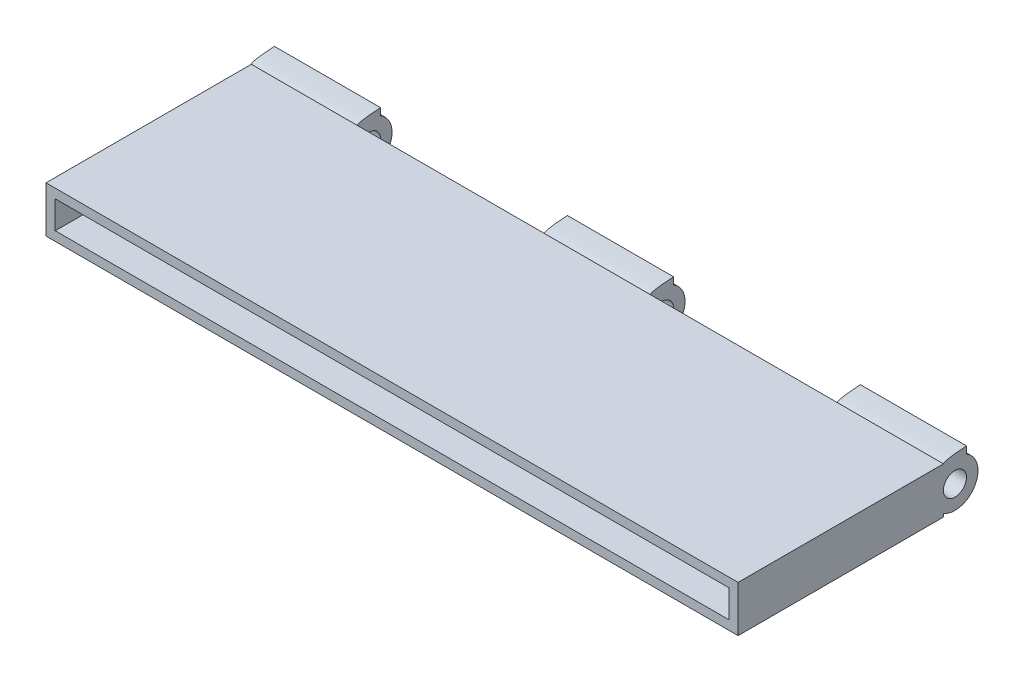
ISO-10303-21;
HEADER;
FILE_DESCRIPTION(('STEP AP214'),'2;1');
FILE_NAME('part.step','',(''),(''),'','','');
FILE_SCHEMA(('AUTOMOTIVE_DESIGN { 1 0 10303 214 1 1 1 1 }'));
ENDSEC;
DATA;
#1=APPLICATION_CONTEXT('core data for automotive mechanical design processes');
#2=APPLICATION_PROTOCOL_DEFINITION('international standard','automotive_design',2000,#1);
#3=PRODUCT_CONTEXT('',#1,'mechanical');
#4=PRODUCT('Part','Part','',(#3));
#5=PRODUCT_RELATED_PRODUCT_CATEGORY('part','',(#4));
#6=PRODUCT_DEFINITION_FORMATION('','',#4);
#7=PRODUCT_DEFINITION_CONTEXT('part definition',#1,'design');
#8=PRODUCT_DEFINITION('design','',#6,#7);
#9=PRODUCT_DEFINITION_SHAPE('','',#8);
#10=(LENGTH_UNIT() NAMED_UNIT(*) SI_UNIT(.MILLI.,.METRE.));
#11=(NAMED_UNIT(*) PLANE_ANGLE_UNIT() SI_UNIT($,.RADIAN.));
#12=(NAMED_UNIT(*) SI_UNIT($,.STERADIAN.) SOLID_ANGLE_UNIT());
#13=UNCERTAINTY_MEASURE_WITH_UNIT(LENGTH_MEASURE(1.E-05),#10,'distance_accuracy_value','');
#14=(GEOMETRIC_REPRESENTATION_CONTEXT(3) GLOBAL_UNCERTAINTY_ASSIGNED_CONTEXT((#13)) GLOBAL_UNIT_ASSIGNED_CONTEXT((#10,
#11,#12)) REPRESENTATION_CONTEXT('',''));
#15=CARTESIAN_POINT('',(0.,0.,0.));
#16=DIRECTION('',(0.,0.,1.));
#17=DIRECTION('',(1.,0.,0.));
#18=AXIS2_PLACEMENT_3D('',#15,#16,#17);
#19=CARTESIAN_POINT('',(154.,6.98677371199543,14.5));
#20=DIRECTION('',(0.,0.,1.));
#21=DIRECTION('',(0.,-1.,0.));
#22=AXIS2_PLACEMENT_3D('',#19,#20,#21);
#23=PLANE('',#22);
#24=DIRECTION('',(-1.,0.,0.));
#25=VECTOR('',#24,1.);
#26=CARTESIAN_POINT('',(154.,4.33012701892219,14.5));
#27=LINE('',#26,#25);
#28=CARTESIAN_POINT('',(52.,4.33012701892219,14.5));
#29=VERTEX_POINT('',#28);
#30=CARTESIAN_POINT('',(11.5,4.33012701892219,14.5));
#31=VERTEX_POINT('',#30);
#32=EDGE_CURVE('E686',#29,#31,#27,.T.);
#33=ORIENTED_EDGE('',*,*,#32,.T.);
#34=DIRECTION('',(0.,-1.,0.));
#35=VECTOR('',#34,1.);
#36=CARTESIAN_POINT('',(11.5,6.,14.5));
#37=LINE('',#36,#35);
#38=CARTESIAN_POINT('',(11.5,5.,14.5));
#39=VERTEX_POINT('',#38);
#40=EDGE_CURVE('E347',#39,#31,#37,.T.);
#41=ORIENTED_EDGE('',*,*,#40,.F.);
#42=DIRECTION('',(1.,0.,0.));
#43=VECTOR('',#42,1.);
#44=CARTESIAN_POINT('',(154.,5.,14.5));
#45=LINE('',#44,#43);
#46=CARTESIAN_POINT('',(52.,5.,14.5));
#47=VERTEX_POINT('',#46);
#48=EDGE_CURVE('E330',#39,#47,#45,.T.);
#49=ORIENTED_EDGE('',*,*,#48,.T.);
#50=DIRECTION('',(0.,-1.,0.));
#51=VECTOR('',#50,1.);
#52=CARTESIAN_POINT('',(52.,6.,14.5));
#53=LINE('',#52,#51);
#54=EDGE_CURVE('E354',#47,#29,#53,.T.);
#55=ORIENTED_EDGE('',*,*,#54,.T.);
#56=EDGE_LOOP('',(#33,#41,#49,#55));
#57=FACE_BOUND('',#56,.T.);
#58=ADVANCED_FACE('F125',(#57),#23,.F.);
#59=CARTESIAN_POINT('',(-75.,-5.,0.));
#60=DIRECTION('',(0.,-1.,0.));
#61=DIRECTION('',(0.,0.,-1.));
#62=AXIS2_PLACEMENT_3D('',#59,#60,#61);
#63=PLANE('',#62);
#64=DIRECTION('',(1.,0.,0.));
#65=VECTOR('',#64,1.);
#66=CARTESIAN_POINT('',(-75.,-5.,59.));
#67=LINE('',#66,#65);
#68=CARTESIAN_POINT('',(-75.,-5.,59.));
#69=VERTEX_POINT('',#68);
#70=CARTESIAN_POINT('',(75.,-5.,59.));
#71=VERTEX_POINT('',#70);
#72=EDGE_CURVE('E363',#69,#71,#67,.T.);
#73=ORIENTED_EDGE('',*,*,#72,.F.);
#74=DIRECTION('',(0.,0.,1.));
#75=VECTOR('',#74,1.);
#76=CARTESIAN_POINT('',(-75.,-5.,0.));
#77=LINE('',#76,#75);
#78=CARTESIAN_POINT('',(-75.,-5.,14.5));
#79=VERTEX_POINT('',#78);
#80=EDGE_CURVE('E795',#79,#69,#77,.T.);
#81=ORIENTED_EDGE('',*,*,#80,.F.);
#82=DIRECTION('',(-1.,0.,0.));
#83=VECTOR('',#82,1.);
#84=CARTESIAN_POINT('',(154.,-5.,14.5));
#85=LINE('',#84,#83);
#86=CARTESIAN_POINT('',(75.,-5.,14.5));
#87=VERTEX_POINT('',#86);
#88=EDGE_CURVE('E337',#87,#79,#85,.T.);
#89=ORIENTED_EDGE('',*,*,#88,.F.);
#90=DIRECTION('',(0.,0.,1.));
#91=VECTOR('',#90,1.);
#92=CARTESIAN_POINT('',(75.,-5.,0.));
#93=LINE('',#92,#91);
#94=EDGE_CURVE('E717',#87,#71,#93,.T.);
#95=ORIENTED_EDGE('',*,*,#94,.T.);
#96=EDGE_LOOP('',(#73,#81,#89,#95));
#97=FACE_BOUND('',#96,.T.);
#98=ADVANCED_FACE('F565',(#97),#63,.T.);
#99=CARTESIAN_POINT('',(-75.,5.,0.));
#100=DIRECTION('',(0.,1.,0.));
#101=DIRECTION('',(-1.,0.,0.));
#102=AXIS2_PLACEMENT_3D('',#99,#100,#101);
#103=PLANE('',#102);
#104=DIRECTION('',(-1.,0.,0.));
#105=VECTOR('',#104,1.);
#106=CARTESIAN_POINT('',(-75.,5.,59.));
#107=LINE('',#106,#105);
#108=CARTESIAN_POINT('',(75.,5.,59.));
#109=VERTEX_POINT('',#108);
#110=CARTESIAN_POINT('',(-75.,5.,59.));
#111=VERTEX_POINT('',#110);
#112=EDGE_CURVE('E842',#109,#111,#107,.T.);
#113=ORIENTED_EDGE('',*,*,#112,.F.);
#114=DIRECTION('',(0.,0.,-1.));
#115=VECTOR('',#114,1.);
#116=CARTESIAN_POINT('',(75.,5.,0.));
#117=LINE('',#116,#115);
#118=CARTESIAN_POINT('',(75.,5.,14.5));
#119=VERTEX_POINT('',#118);
#120=EDGE_CURVE('E713',#109,#119,#117,.T.);
#121=ORIENTED_EDGE('',*,*,#120,.T.);
#122=CARTESIAN_POINT('',(50.85,5.,14.5));
#123=CARTESIAN_POINT('',(59.2833333333334,5.,14.5));
#124=CARTESIAN_POINT('',(67.7166666666666,5.,14.5));
#125=CARTESIAN_POINT('',(76.15,5.,14.5));
#126=(BOUNDED_CURVE() B_SPLINE_CURVE(3,(#122,#123,#124,#125),.UNSPECIFIED.,.F.,
.F.) B_SPLINE_CURVE_WITH_KNOTS((4,4),(-0.02415,0.00115),
.UNSPECIFIED.) CURVE() GEOMETRIC_REPRESENTATION_ITEM() RATIONAL_B_SPLINE_CURVE((1.,1.,1.,1.)) REPRESENTATION_ITEM(''));
#127=EDGE_CURVE('E373',#47,#119,#126,.T.);
#128=ORIENTED_EDGE('',*,*,#127,.F.);
#129=ORIENTED_EDGE('',*,*,#48,.F.);
#130=CARTESIAN_POINT('',(-12.65,5.,14.5));
#131=CARTESIAN_POINT('',(-4.21666666666668,5.,14.5));
#132=CARTESIAN_POINT('',(4.21666666666665,5.,14.5));
#133=CARTESIAN_POINT('',(12.65,5.,14.5));
#134=(BOUNDED_CURVE() B_SPLINE_CURVE(3,(#130,#131,#132,#133),.UNSPECIFIED.,.F.,
.F.) B_SPLINE_CURVE_WITH_KNOTS((4,4),(-0.02415,0.00115),
.UNSPECIFIED.) CURVE() GEOMETRIC_REPRESENTATION_ITEM() RATIONAL_B_SPLINE_CURVE((1.,1.,1.,1.)) REPRESENTATION_ITEM(''));
#135=CARTESIAN_POINT('',(-11.5,5.,14.5));
#136=VERTEX_POINT('',#135);
#137=EDGE_CURVE('E473',#136,#39,#134,.T.);
#138=ORIENTED_EDGE('',*,*,#137,.F.);
#139=CARTESIAN_POINT('',(-52.,5.,14.5));
#140=VERTEX_POINT('',#139);
#141=EDGE_CURVE('E324',#140,#136,#45,.T.);
#142=ORIENTED_EDGE('',*,*,#141,.F.);
#143=CARTESIAN_POINT('',(-76.15,5.,14.5));
#144=CARTESIAN_POINT('',(-67.7166666666666,5.,14.5));
#145=CARTESIAN_POINT('',(-59.2833333333334,5.,14.5));
#146=CARTESIAN_POINT('',(-50.85,5.,14.5));
#147=(BOUNDED_CURVE() B_SPLINE_CURVE(3,(#143,#144,#145,#146),.UNSPECIFIED.,.F.,
.F.) B_SPLINE_CURVE_WITH_KNOTS((4,4),(-0.02415,0.00115),
.UNSPECIFIED.) CURVE() GEOMETRIC_REPRESENTATION_ITEM() RATIONAL_B_SPLINE_CURVE((1.,1.,1.,1.)) REPRESENTATION_ITEM(''));
#148=CARTESIAN_POINT('',(-75.,5.,14.5));
#149=VERTEX_POINT('',#148);
#150=EDGE_CURVE('E329',#149,#140,#147,.T.);
#151=ORIENTED_EDGE('',*,*,#150,.F.);
#152=DIRECTION('',(0.,0.,1.));
#153=VECTOR('',#152,1.);
#154=CARTESIAN_POINT('',(-75.,5.,0.));
#155=LINE('',#154,#153);
#156=EDGE_CURVE('E706',#149,#111,#155,.T.);
#157=ORIENTED_EDGE('',*,*,#156,.T.);
#158=EDGE_LOOP('',(#113,#121,#128,#129,#138,#142,#151,#157));
#159=FACE_BOUND('',#158,.T.);
#160=ADVANCED_FACE('F554',(#159),#103,.T.);
#161=CARTESIAN_POINT('',(-11.5,4.33012701892219,14.5));
#162=VERTEX_POINT('',#161);
#163=CARTESIAN_POINT('',(-52.,4.33012701892219,14.5));
#164=VERTEX_POINT('',#163);
#165=EDGE_CURVE('E680',#162,#164,#27,.T.);
#166=ORIENTED_EDGE('',*,*,#165,.T.);
#167=DIRECTION('',(0.,-1.,0.));
#168=VECTOR('',#167,1.);
#169=CARTESIAN_POINT('',(-52.,6.,14.5));
#170=LINE('',#169,#168);
#171=EDGE_CURVE('E288',#140,#164,#170,.T.);
#172=ORIENTED_EDGE('',*,*,#171,.F.);
#173=ORIENTED_EDGE('',*,*,#141,.T.);
#174=DIRECTION('',(0.,-1.,0.));
#175=VECTOR('',#174,1.);
#176=CARTESIAN_POINT('',(-11.5,6.,14.5));
#177=LINE('',#176,#175);
#178=EDGE_CURVE('E474',#136,#162,#177,.T.);
#179=ORIENTED_EDGE('',*,*,#178,.T.);
#180=EDGE_LOOP('',(#166,#172,#173,#179));
#181=FACE_BOUND('',#180,.T.);
#182=ADVANCED_FACE('F564',(#181),#23,.F.);
#183=CARTESIAN_POINT('',(154.,-4.33012701892219,14.5));
#184=DIRECTION('',(0.,0.,1.));
#185=DIRECTION('',(1.,0.,0.));
#186=AXIS2_PLACEMENT_3D('',#183,#184,#185);
#187=PLANE('',#186);
#188=DIRECTION('',(0.,1.,0.));
#189=VECTOR('',#188,1.);
#190=CARTESIAN_POINT('',(75.,50.,14.5));
#191=LINE('',#190,#189);
#192=CARTESIAN_POINT('',(75.,-4.33012701892219,14.5));
#193=VERTEX_POINT('',#192);
#194=EDGE_CURVE('E710',#87,#193,#191,.T.);
#195=ORIENTED_EDGE('',*,*,#194,.F.);
#196=ORIENTED_EDGE('',*,*,#88,.T.);
#197=DIRECTION('',(0.,1.,0.));
#198=VECTOR('',#197,1.);
#199=CARTESIAN_POINT('',(-75.,-4.33012701892219,14.5));
#200=LINE('',#199,#198);
#201=CARTESIAN_POINT('',(-75.,-4.33012701892219,14.5));
#202=VERTEX_POINT('',#201);
#203=EDGE_CURVE('E301',#79,#202,#200,.T.);
#204=ORIENTED_EDGE('',*,*,#203,.T.);
#205=DIRECTION('',(-1.,0.,0.));
#206=VECTOR('',#205,1.);
#207=CARTESIAN_POINT('',(154.,-4.33012701892219,14.5));
#208=LINE('',#207,#206);
#209=CARTESIAN_POINT('',(-52.,-4.33012701892219,14.5));
#210=VERTEX_POINT('',#209);
#211=EDGE_CURVE('E790',#210,#202,#208,.T.);
#212=ORIENTED_EDGE('',*,*,#211,.F.);
#213=CARTESIAN_POINT('',(-11.5,-4.33012701892219,14.5));
#214=VERTEX_POINT('',#213);
#215=EDGE_CURVE('E690',#214,#210,#208,.T.);
#216=ORIENTED_EDGE('',*,*,#215,.F.);
#217=CARTESIAN_POINT('',(11.5,-4.33012701892219,14.5));
#218=VERTEX_POINT('',#217);
#219=EDGE_CURVE('E803',#218,#214,#208,.T.);
#220=ORIENTED_EDGE('',*,*,#219,.F.);
#221=CARTESIAN_POINT('',(52.,-4.33012701892219,14.5));
#222=VERTEX_POINT('',#221);
#223=EDGE_CURVE('E800',#222,#218,#208,.T.);
#224=ORIENTED_EDGE('',*,*,#223,.F.);
#225=EDGE_CURVE('E687',#193,#222,#208,.T.);
#226=ORIENTED_EDGE('',*,*,#225,.F.);
#227=EDGE_LOOP('',(#195,#196,#204,#212,#216,#220,#224,#226));
#228=FACE_BOUND('',#227,.T.);
#229=ADVANCED_FACE('F566',(#228),#187,.F.);
#230=CARTESIAN_POINT('',(154.,0.,12.));
#231=DIRECTION('',(-1.,0.,0.));
#232=DIRECTION('',(0.,0.,1.));
#233=AXIS2_PLACEMENT_3D('',#230,#231,#232);
#234=CYLINDRICAL_SURFACE('',#233,5.);
#235=ORIENTED_EDGE('',*,*,#32,.F.);
#236=CARTESIAN_POINT('',(52.,0.,12.));
#237=DIRECTION('',(-1.,0.,0.));
#238=DIRECTION('',(0.,0.,1.));
#239=AXIS2_PLACEMENT_3D('',#236,#237,#238);
#240=CIRCLE('',#239,5.);
#241=EDGE_CURVE('E750',#222,#29,#240,.T.);
#242=ORIENTED_EDGE('',*,*,#241,.F.);
#243=ORIENTED_EDGE('',*,*,#223,.T.);
#244=CARTESIAN_POINT('',(11.5,0.,12.));
#245=DIRECTION('',(-1.,0.,0.));
#246=DIRECTION('',(0.,0.,1.));
#247=AXIS2_PLACEMENT_3D('',#244,#245,#246);
#248=CIRCLE('',#247,5.);
#249=EDGE_CURVE('E773',#218,#31,#248,.T.);
#250=ORIENTED_EDGE('',*,*,#249,.T.);
#251=EDGE_LOOP('',(#235,#242,#243,#250));
#252=FACE_BOUND('',#251,.T.);
#253=ADVANCED_FACE('F676',(#252),#234,.F.);
#254=ORIENTED_EDGE('',*,*,#165,.F.);
#255=CARTESIAN_POINT('',(-11.5,0.,12.));
#256=DIRECTION('',(-1.,0.,0.));
#257=DIRECTION('',(0.,0.,1.));
#258=AXIS2_PLACEMENT_3D('',#255,#256,#257);
#259=CIRCLE('',#258,5.);
#260=EDGE_CURVE('E765',#214,#162,#259,.T.);
#261=ORIENTED_EDGE('',*,*,#260,.F.);
#262=ORIENTED_EDGE('',*,*,#215,.T.);
#263=CARTESIAN_POINT('',(-52.,0.,12.));
#264=DIRECTION('',(-1.,0.,0.));
#265=DIRECTION('',(0.,0.,1.));
#266=AXIS2_PLACEMENT_3D('',#263,#264,#265);
#267=CIRCLE('',#266,5.);
#268=EDGE_CURVE('E296',#210,#164,#267,.T.);
#269=ORIENTED_EDGE('',*,*,#268,.T.);
#270=EDGE_LOOP('',(#254,#261,#262,#269));
#271=FACE_BOUND('',#270,.T.);
#272=ADVANCED_FACE('F634',(#271),#234,.F.);
#273=CARTESIAN_POINT('',(75.,50.,1.));
#274=DIRECTION('',(-1.,0.,0.));
#275=DIRECTION('',(0.,0.,1.));
#276=AXIS2_PLACEMENT_3D('',#273,#274,#275);
#277=PLANE('',#276);
#278=DIRECTION('',(0.,-1.,0.));
#279=VECTOR('',#278,1.);
#280=CARTESIAN_POINT('',(75.,6.,9.5));
#281=LINE('',#280,#279);
#282=CARTESIAN_POINT('',(75.,5.86602540378444,9.5));
#283=VERTEX_POINT('',#282);
#284=CARTESIAN_POINT('',(75.,4.33012701892219,9.5));
#285=VERTEX_POINT('',#284);
#286=EDGE_CURVE('E353',#283,#285,#281,.T.);
#287=ORIENTED_EDGE('',*,*,#286,.F.);
#288=CARTESIAN_POINT('',(75.,5.,14.5));
#289=CARTESIAN_POINT('',(75.,6.,14.5));
#290=CARTESIAN_POINT('',(75.,6.,4.5));
#291=(BOUNDED_CURVE() B_SPLINE_CURVE(2,(#288,#289,#290),.UNSPECIFIED.,.F.,
.F.) B_SPLINE_CURVE_WITH_KNOTS((3,3),(0.,1.),
.UNSPECIFIED.) CURVE() GEOMETRIC_REPRESENTATION_ITEM() RATIONAL_B_SPLINE_CURVE((1.,
0.707106781186548,1.)) REPRESENTATION_ITEM(''));
#292=EDGE_CURVE('E73',#283,#119,#291,.F.);
#293=ORIENTED_EDGE('',*,*,#292,.T.);
#294=ORIENTED_EDGE('',*,*,#120,.F.);
#295=DIRECTION('',(0.,-1.,0.));
#296=VECTOR('',#295,1.);
#297=CARTESIAN_POINT('',(75.,177.,59.));
#298=LINE('',#297,#296);
#299=EDGE_CURVE('E855',#109,#71,#298,.T.);
#300=ORIENTED_EDGE('',*,*,#299,.T.);
#301=ORIENTED_EDGE('',*,*,#94,.F.);
#302=ORIENTED_EDGE('',*,*,#194,.T.);
#303=CARTESIAN_POINT('',(75.,0.,12.));
#304=DIRECTION('',(-1.,0.,0.));
#305=DIRECTION('',(0.,0.,1.));
#306=AXIS2_PLACEMENT_3D('',#303,#304,#305);
#307=CIRCLE('',#306,5.);
#308=EDGE_CURVE('E754',#285,#193,#307,.T.);
#309=ORIENTED_EDGE('',*,*,#308,.F.);
#310=EDGE_LOOP('',(#287,#293,#294,#300,#301,#302,#309));
#311=FACE_BOUND('',#310,.T.);
#312=CARTESIAN_POINT('',(75.,0.,12.));
#313=DIRECTION('',(-1.,0.,0.));
#314=DIRECTION('',(0.,0.,1.));
#315=AXIS2_PLACEMENT_3D('',#312,#313,#314);
#316=CIRCLE('',#315,2.5);
#317=CARTESIAN_POINT('',(75.,0.,14.5));
#318=VERTEX_POINT('',#317);
#319=EDGE_CURVE('E746',#318,#318,#316,.T.);
#320=ORIENTED_EDGE('',*,*,#319,.T.);
#321=EDGE_LOOP('',(#320));
#322=FACE_BOUND('',#321,.T.);
#323=ADVANCED_FACE('F625',(#311,#322),#277,.F.);
#324=CARTESIAN_POINT('',(-75.,-30.,1.));
#325=DIRECTION('',(1.,0.,0.));
#326=DIRECTION('',(0.,0.,-1.));
#327=AXIS2_PLACEMENT_3D('',#324,#325,#326);
#328=PLANE('',#327);
#329=ORIENTED_EDGE('',*,*,#156,.F.);
#330=CARTESIAN_POINT('',(-75.,6.,4.5));
#331=CARTESIAN_POINT('',(-75.,6.,14.5));
#332=CARTESIAN_POINT('',(-75.,5.,14.5));
#333=(BOUNDED_CURVE() B_SPLINE_CURVE(2,(#330,#331,#332),.UNSPECIFIED.,.F.,
.F.) B_SPLINE_CURVE_WITH_KNOTS((3,3),(0.,1.),
.UNSPECIFIED.) CURVE() GEOMETRIC_REPRESENTATION_ITEM() RATIONAL_B_SPLINE_CURVE((1.,
0.707106781186548,1.)) REPRESENTATION_ITEM(''));
#334=CARTESIAN_POINT('',(-75.,5.86602540378444,9.5));
#335=VERTEX_POINT('',#334);
#336=EDGE_CURVE('E621',#149,#335,#333,.F.);
#337=ORIENTED_EDGE('',*,*,#336,.T.);
#338=DIRECTION('',(0.,-1.,0.));
#339=VECTOR('',#338,1.);
#340=CARTESIAN_POINT('',(-75.,6.,9.5));
#341=LINE('',#340,#339);
#342=CARTESIAN_POINT('',(-75.,4.33012701892219,9.5));
#343=VERTEX_POINT('',#342);
#344=EDGE_CURVE('E289',#335,#343,#341,.T.);
#345=ORIENTED_EDGE('',*,*,#344,.T.);
#346=CARTESIAN_POINT('',(-75.,0.,12.));
#347=DIRECTION('',(-1.,0.,0.));
#348=DIRECTION('',(0.,0.,1.));
#349=AXIS2_PLACEMENT_3D('',#346,#347,#348);
#350=CIRCLE('',#349,5.);
#351=EDGE_CURVE('E305',#343,#202,#350,.T.);
#352=ORIENTED_EDGE('',*,*,#351,.T.);
#353=ORIENTED_EDGE('',*,*,#203,.F.);
#354=ORIENTED_EDGE('',*,*,#80,.T.);
#355=DIRECTION('',(0.,-1.,0.));
#356=VECTOR('',#355,1.);
#357=CARTESIAN_POINT('',(-75.,177.,59.));
#358=LINE('',#357,#356);
#359=EDGE_CURVE('E822',#111,#69,#358,.T.);
#360=ORIENTED_EDGE('',*,*,#359,.F.);
#361=EDGE_LOOP('',(#329,#337,#345,#352,#353,#354,#360));
#362=FACE_BOUND('',#361,.T.);
#363=CARTESIAN_POINT('',(-75.,0.,12.));
#364=DIRECTION('',(-1.,0.,0.));
#365=DIRECTION('',(0.,0.,1.));
#366=AXIS2_PLACEMENT_3D('',#363,#364,#365);
#367=CIRCLE('',#366,2.5);
#368=CARTESIAN_POINT('',(-75.,0.,14.5));
#369=VERTEX_POINT('',#368);
#370=EDGE_CURVE('E772',#369,#369,#367,.T.);
#371=ORIENTED_EDGE('',*,*,#370,.F.);
#372=EDGE_LOOP('',(#371));
#373=FACE_BOUND('',#372,.T.);
#374=ADVANCED_FACE('F633',(#362,#373),#328,.F.);
#375=CARTESIAN_POINT('',(-52.,0.,12.));
#376=DIRECTION('',(-1.,0.,0.));
#377=DIRECTION('',(0.,0.,1.));
#378=AXIS2_PLACEMENT_3D('',#375,#376,#377);
#379=CYLINDRICAL_SURFACE('',#378,5.);
#380=DIRECTION('',(-1.,0.,0.));
#381=VECTOR('',#380,1.);
#382=CARTESIAN_POINT('',(11.5,4.3301270189222,9.50000000000001));
#383=LINE('',#382,#381);
#384=CARTESIAN_POINT('',(-52.,4.33012701892219,9.5));
#385=VERTEX_POINT('',#384);
#386=EDGE_CURVE('E281',#385,#343,#383,.T.);
#387=ORIENTED_EDGE('',*,*,#386,.F.);
#388=EDGE_CURVE('E292',#385,#210,#267,.T.);
#389=ORIENTED_EDGE('',*,*,#388,.T.);
#390=ORIENTED_EDGE('',*,*,#211,.T.);
#391=ORIENTED_EDGE('',*,*,#351,.F.);
#392=EDGE_LOOP('',(#387,#389,#390,#391));
#393=FACE_BOUND('',#392,.T.);
#394=ADVANCED_FACE('F304',(#393),#379,.T.);
#395=CARTESIAN_POINT('',(-52.,0.,12.));
#396=DIRECTION('',(-1.,0.,0.));
#397=DIRECTION('',(0.,0.,1.));
#398=AXIS2_PLACEMENT_3D('',#395,#396,#397);
#399=PLANE('',#398);
#400=CARTESIAN_POINT('',(-52.,0.,12.));
#401=DIRECTION('',(-1.,0.,0.));
#402=DIRECTION('',(0.,0.,1.));
#403=AXIS2_PLACEMENT_3D('',#400,#401,#402);
#404=CIRCLE('',#403,2.5);
#405=CARTESIAN_POINT('',(-52.,0.,14.5));
#406=VERTEX_POINT('',#405);
#407=EDGE_CURVE('E777',#406,#406,#404,.T.);
#408=ORIENTED_EDGE('',*,*,#407,.T.);
#409=EDGE_LOOP('',(#408));
#410=FACE_BOUND('',#409,.T.);
#411=DIRECTION('',(0.,-1.,0.));
#412=VECTOR('',#411,1.);
#413=CARTESIAN_POINT('',(-52.,6.,9.5));
#414=LINE('',#413,#412);
#415=CARTESIAN_POINT('',(-52.,5.86602540378444,9.5));
#416=VERTEX_POINT('',#415);
#417=EDGE_CURVE('E276',#416,#385,#414,.T.);
#418=ORIENTED_EDGE('',*,*,#417,.F.);
#419=CARTESIAN_POINT('',(-52.,5.,14.5));
#420=CARTESIAN_POINT('',(-52.,6.,14.5));
#421=CARTESIAN_POINT('',(-52.,6.,4.5));
#422=(BOUNDED_CURVE() B_SPLINE_CURVE(2,(#419,#420,#421),.UNSPECIFIED.,.F.,
.F.) B_SPLINE_CURVE_WITH_KNOTS((3,3),(0.,1.),
.UNSPECIFIED.) CURVE() GEOMETRIC_REPRESENTATION_ITEM() RATIONAL_B_SPLINE_CURVE((1.,
0.707106781186548,1.)) REPRESENTATION_ITEM(''));
#423=EDGE_CURVE('E603',#416,#140,#422,.F.);
#424=ORIENTED_EDGE('',*,*,#423,.T.);
#425=ORIENTED_EDGE('',*,*,#171,.T.);
#426=ORIENTED_EDGE('',*,*,#268,.F.);
#427=ORIENTED_EDGE('',*,*,#388,.F.);
#428=EDGE_LOOP('',(#418,#424,#425,#426,#427));
#429=FACE_BOUND('',#428,.T.);
#430=ADVANCED_FACE('F293',(#410,#429),#399,.F.);
#431=CARTESIAN_POINT('',(-52.,0.,12.));
#432=DIRECTION('',(-1.,0.,0.));
#433=DIRECTION('',(0.,0.,1.));
#434=AXIS2_PLACEMENT_3D('',#431,#432,#433);
#435=CYLINDRICAL_SURFACE('',#434,2.5);
#436=ORIENTED_EDGE('',*,*,#407,.F.);
#437=EDGE_LOOP('',(#436));
#438=FACE_BOUND('',#437,.T.);
#439=ORIENTED_EDGE('',*,*,#370,.T.);
#440=EDGE_LOOP('',(#439));
#441=FACE_BOUND('',#440,.T.);
#442=ADVANCED_FACE('F1039',(#438,#441),#435,.F.);
#443=CARTESIAN_POINT('',(11.5,0.,12.));
#444=DIRECTION('',(-1.,0.,0.));
#445=DIRECTION('',(0.,0.,1.));
#446=AXIS2_PLACEMENT_3D('',#443,#444,#445);
#447=CYLINDRICAL_SURFACE('',#446,5.);
#448=DIRECTION('',(-1.,0.,0.));
#449=VECTOR('',#448,1.);
#450=CARTESIAN_POINT('',(11.5,4.33012701892219,9.5));
#451=LINE('',#450,#449);
#452=CARTESIAN_POINT('',(11.5,4.33012701892219,9.5));
#453=VERTEX_POINT('',#452);
#454=CARTESIAN_POINT('',(-11.5,4.33012701892219,9.5));
#455=VERTEX_POINT('',#454);
#456=EDGE_CURVE('E319',#453,#455,#451,.T.);
#457=ORIENTED_EDGE('',*,*,#456,.F.);
#458=EDGE_CURVE('E769',#453,#218,#248,.T.);
#459=ORIENTED_EDGE('',*,*,#458,.T.);
#460=ORIENTED_EDGE('',*,*,#219,.T.);
#461=EDGE_CURVE('E774',#455,#214,#259,.T.);
#462=ORIENTED_EDGE('',*,*,#461,.F.);
#463=EDGE_LOOP('',(#457,#459,#460,#462));
#464=FACE_BOUND('',#463,.T.);
#465=ADVANCED_FACE('F438',(#464),#447,.T.);
#466=CARTESIAN_POINT('',(11.5,0.,12.));
#467=DIRECTION('',(-1.,0.,0.));
#468=DIRECTION('',(0.,0.,1.));
#469=AXIS2_PLACEMENT_3D('',#466,#467,#468);
#470=PLANE('',#469);
#471=CARTESIAN_POINT('',(11.5,0.,12.));
#472=DIRECTION('',(-1.,0.,0.));
#473=DIRECTION('',(0.,0.,1.));
#474=AXIS2_PLACEMENT_3D('',#471,#472,#473);
#475=CIRCLE('',#474,2.5);
#476=CARTESIAN_POINT('',(11.5,0.,14.5));
#477=VERTEX_POINT('',#476);
#478=EDGE_CURVE('E761',#477,#477,#475,.T.);
#479=ORIENTED_EDGE('',*,*,#478,.T.);
#480=EDGE_LOOP('',(#479));
#481=FACE_BOUND('',#480,.T.);
#482=DIRECTION('',(0.,-1.,0.));
#483=VECTOR('',#482,1.);
#484=CARTESIAN_POINT('',(11.5,6.,9.5));
#485=LINE('',#484,#483);
#486=CARTESIAN_POINT('',(11.5,5.86602540378444,9.5));
#487=VERTEX_POINT('',#486);
#488=EDGE_CURVE('E469',#487,#453,#485,.T.);
#489=ORIENTED_EDGE('',*,*,#488,.F.);
#490=CARTESIAN_POINT('',(11.5,5.,14.5));
#491=CARTESIAN_POINT('',(11.5,6.,14.5));
#492=CARTESIAN_POINT('',(11.5,6.,4.5));
#493=(BOUNDED_CURVE() B_SPLINE_CURVE(2,(#490,#491,#492),.UNSPECIFIED.,.F.,
.F.) B_SPLINE_CURVE_WITH_KNOTS((3,3),(0.,1.),
.UNSPECIFIED.) CURVE() GEOMETRIC_REPRESENTATION_ITEM() RATIONAL_B_SPLINE_CURVE((1.,
0.707106781186548,1.)) REPRESENTATION_ITEM(''));
#494=EDGE_CURVE('E454',#487,#39,#493,.F.);
#495=ORIENTED_EDGE('',*,*,#494,.T.);
#496=ORIENTED_EDGE('',*,*,#40,.T.);
#497=ORIENTED_EDGE('',*,*,#249,.F.);
#498=ORIENTED_EDGE('',*,*,#458,.F.);
#499=EDGE_LOOP('',(#489,#495,#496,#497,#498));
#500=FACE_BOUND('',#499,.T.);
#501=ADVANCED_FACE('F434',(#481,#500),#470,.F.);
#502=CARTESIAN_POINT('',(-11.5,0.,12.));
#503=DIRECTION('',(-1.,0.,0.));
#504=DIRECTION('',(0.,0.,1.));
#505=AXIS2_PLACEMENT_3D('',#502,#503,#504);
#506=PLANE('',#505);
#507=CARTESIAN_POINT('',(-11.5,0.,12.));
#508=DIRECTION('',(-1.,0.,0.));
#509=DIRECTION('',(0.,0.,1.));
#510=AXIS2_PLACEMENT_3D('',#507,#508,#509);
#511=CIRCLE('',#510,2.5);
#512=CARTESIAN_POINT('',(-11.5,0.,14.5));
#513=VERTEX_POINT('',#512);
#514=EDGE_CURVE('E757',#513,#513,#511,.T.);
#515=ORIENTED_EDGE('',*,*,#514,.F.);
#516=EDGE_LOOP('',(#515));
#517=FACE_BOUND('',#516,.T.);
#518=ORIENTED_EDGE('',*,*,#178,.F.);
#519=CARTESIAN_POINT('',(-11.5,6.,4.5));
#520=CARTESIAN_POINT('',(-11.5,6.,14.5));
#521=CARTESIAN_POINT('',(-11.5,5.,14.5));
#522=(BOUNDED_CURVE() B_SPLINE_CURVE(2,(#519,#520,#521),.UNSPECIFIED.,.F.,
.F.) B_SPLINE_CURVE_WITH_KNOTS((3,3),(0.,1.),
.UNSPECIFIED.) CURVE() GEOMETRIC_REPRESENTATION_ITEM() RATIONAL_B_SPLINE_CURVE((1.,
0.707106781186548,1.)) REPRESENTATION_ITEM(''));
#523=CARTESIAN_POINT('',(-11.5,5.86602540378444,9.5));
#524=VERTEX_POINT('',#523);
#525=EDGE_CURVE('E493',#136,#524,#522,.F.);
#526=ORIENTED_EDGE('',*,*,#525,.T.);
#527=DIRECTION('',(0.,-1.,0.));
#528=VECTOR('',#527,1.);
#529=CARTESIAN_POINT('',(-11.5,6.,9.5));
#530=LINE('',#529,#528);
#531=EDGE_CURVE('E331',#524,#455,#530,.T.);
#532=ORIENTED_EDGE('',*,*,#531,.T.);
#533=ORIENTED_EDGE('',*,*,#461,.T.);
#534=ORIENTED_EDGE('',*,*,#260,.T.);
#535=EDGE_LOOP('',(#518,#526,#532,#533,#534));
#536=FACE_BOUND('',#535,.T.);
#537=ADVANCED_FACE('F432',(#517,#536),#506,.T.);
#538=CARTESIAN_POINT('',(11.5,0.,12.));
#539=DIRECTION('',(-1.,0.,0.));
#540=DIRECTION('',(0.,0.,1.));
#541=AXIS2_PLACEMENT_3D('',#538,#539,#540);
#542=CYLINDRICAL_SURFACE('',#541,2.5);
#543=ORIENTED_EDGE('',*,*,#478,.F.);
#544=EDGE_LOOP('',(#543));
#545=FACE_BOUND('',#544,.T.);
#546=ORIENTED_EDGE('',*,*,#514,.T.);
#547=EDGE_LOOP('',(#546));
#548=FACE_BOUND('',#547,.T.);
#549=ADVANCED_FACE('F428',(#545,#548),#542,.F.);
#550=CARTESIAN_POINT('',(75.,0.,12.));
#551=DIRECTION('',(-1.,0.,0.));
#552=DIRECTION('',(0.,0.,1.));
#553=AXIS2_PLACEMENT_3D('',#550,#551,#552);
#554=CYLINDRICAL_SURFACE('',#553,5.);
#555=DIRECTION('',(-1.,0.,0.));
#556=VECTOR('',#555,1.);
#557=CARTESIAN_POINT('',(11.5,4.33012701892219,9.5));
#558=LINE('',#557,#556);
#559=CARTESIAN_POINT('',(52.,4.33012701892219,9.5));
#560=VERTEX_POINT('',#559);
#561=EDGE_CURVE('E368',#285,#560,#558,.T.);
#562=ORIENTED_EDGE('',*,*,#561,.F.);
#563=ORIENTED_EDGE('',*,*,#308,.T.);
#564=ORIENTED_EDGE('',*,*,#225,.T.);
#565=EDGE_CURVE('E758',#560,#222,#240,.T.);
#566=ORIENTED_EDGE('',*,*,#565,.F.);
#567=EDGE_LOOP('',(#562,#563,#564,#566));
#568=FACE_BOUND('',#567,.T.);
#569=ADVANCED_FACE('F424',(#568),#554,.T.);
#570=CARTESIAN_POINT('',(52.,0.,12.));
#571=DIRECTION('',(-1.,0.,0.));
#572=DIRECTION('',(0.,0.,1.));
#573=AXIS2_PLACEMENT_3D('',#570,#571,#572);
#574=PLANE('',#573);
#575=CARTESIAN_POINT('',(52.,0.,12.));
#576=DIRECTION('',(-1.,0.,0.));
#577=DIRECTION('',(0.,0.,1.));
#578=AXIS2_PLACEMENT_3D('',#575,#576,#577);
#579=CIRCLE('',#578,2.5);
#580=CARTESIAN_POINT('',(52.,0.,14.5));
#581=VERTEX_POINT('',#580);
#582=EDGE_CURVE('E742',#581,#581,#579,.T.);
#583=ORIENTED_EDGE('',*,*,#582,.F.);
#584=EDGE_LOOP('',(#583));
#585=FACE_BOUND('',#584,.T.);
#586=ORIENTED_EDGE('',*,*,#54,.F.);
#587=CARTESIAN_POINT('',(52.,6.,4.5));
#588=CARTESIAN_POINT('',(52.,6.,14.5));
#589=CARTESIAN_POINT('',(52.,5.,14.5));
#590=(BOUNDED_CURVE() B_SPLINE_CURVE(2,(#587,#588,#589),.UNSPECIFIED.,.F.,
.F.) B_SPLINE_CURVE_WITH_KNOTS((3,3),(0.,1.),
.UNSPECIFIED.) CURVE() GEOMETRIC_REPRESENTATION_ITEM() RATIONAL_B_SPLINE_CURVE((1.,
0.707106781186548,1.)) REPRESENTATION_ITEM(''));
#591=CARTESIAN_POINT('',(52.,5.86602540378444,9.5));
#592=VERTEX_POINT('',#591);
#593=EDGE_CURVE('E156',#47,#592,#590,.F.);
#594=ORIENTED_EDGE('',*,*,#593,.T.);
#595=DIRECTION('',(0.,-1.,0.));
#596=VECTOR('',#595,1.);
#597=CARTESIAN_POINT('',(52.,6.,9.5));
#598=LINE('',#597,#596);
#599=EDGE_CURVE('E350',#592,#560,#598,.T.);
#600=ORIENTED_EDGE('',*,*,#599,.T.);
#601=ORIENTED_EDGE('',*,*,#565,.T.);
#602=ORIENTED_EDGE('',*,*,#241,.T.);
#603=EDGE_LOOP('',(#586,#594,#600,#601,#602));
#604=FACE_BOUND('',#603,.T.);
#605=ADVANCED_FACE('F419',(#585,#604),#574,.T.);
#606=CARTESIAN_POINT('',(75.,0.,12.));
#607=DIRECTION('',(-1.,0.,0.));
#608=DIRECTION('',(0.,0.,1.));
#609=AXIS2_PLACEMENT_3D('',#606,#607,#608);
#610=CYLINDRICAL_SURFACE('',#609,2.5);
#611=ORIENTED_EDGE('',*,*,#319,.F.);
#612=EDGE_LOOP('',(#611));
#613=FACE_BOUND('',#612,.T.);
#614=ORIENTED_EDGE('',*,*,#582,.T.);
#615=EDGE_LOOP('',(#614));
#616=FACE_BOUND('',#615,.T.);
#617=ADVANCED_FACE('F398',(#613,#616),#610,.F.);
#618=CARTESIAN_POINT('',(-75.,177.,59.));
#619=DIRECTION('',(0.,0.,-1.));
#620=DIRECTION('',(-1.,0.,0.));
#621=AXIS2_PLACEMENT_3D('',#618,#619,#620);
#622=PLANE('',#621);
#623=ORIENTED_EDGE('',*,*,#112,.T.);
#624=ORIENTED_EDGE('',*,*,#359,.T.);
#625=ORIENTED_EDGE('',*,*,#72,.T.);
#626=ORIENTED_EDGE('',*,*,#299,.F.);
#627=EDGE_LOOP('',(#623,#624,#625,#626));
#628=FACE_BOUND('',#627,.T.);
#629=DIRECTION('',(-1.,0.,0.));
#630=VECTOR('',#629,1.);
#631=CARTESIAN_POINT('',(137.,3.,59.));
#632=LINE('',#631,#630);
#633=CARTESIAN_POINT('',(73.,3.,59.));
#634=VERTEX_POINT('',#633);
#635=CARTESIAN_POINT('',(-73.,3.,59.));
#636=VERTEX_POINT('',#635);
#637=EDGE_CURVE('E847',#634,#636,#632,.T.);
#638=ORIENTED_EDGE('',*,*,#637,.F.);
#639=DIRECTION('',(0.,1.,0.));
#640=VECTOR('',#639,1.);
#641=CARTESIAN_POINT('',(73.,0.,59.));
#642=LINE('',#641,#640);
#643=CARTESIAN_POINT('',(73.,-3.,59.));
#644=VERTEX_POINT('',#643);
#645=EDGE_CURVE('E697',#644,#634,#642,.T.);
#646=ORIENTED_EDGE('',*,*,#645,.F.);
#647=DIRECTION('',(1.,0.,0.));
#648=VECTOR('',#647,1.);
#649=CARTESIAN_POINT('',(-73.,-3.,59.));
#650=LINE('',#649,#648);
#651=CARTESIAN_POINT('',(-73.,-3.,59.));
#652=VERTEX_POINT('',#651);
#653=EDGE_CURVE('E851',#652,#644,#650,.T.);
#654=ORIENTED_EDGE('',*,*,#653,.F.);
#655=DIRECTION('',(0.,-1.,0.));
#656=VECTOR('',#655,1.);
#657=CARTESIAN_POINT('',(-73.,3.,59.));
#658=LINE('',#657,#656);
#659=EDGE_CURVE('E844',#636,#652,#658,.T.);
#660=ORIENTED_EDGE('',*,*,#659,.F.);
#661=EDGE_LOOP('',(#638,#646,#654,#660));
#662=FACE_BOUND('',#661,.T.);
#663=ADVANCED_FACE('F394',(#628,#662),#622,.F.);
#664=CARTESIAN_POINT('',(0.,0.,19.));
#665=DIRECTION('',(0.,0.,1.));
#666=DIRECTION('',(1.,0.,0.));
#667=AXIS2_PLACEMENT_3D('',#664,#665,#666);
#668=PLANE('',#667);
#669=DIRECTION('',(1.,0.,0.));
#670=VECTOR('',#669,1.);
#671=CARTESIAN_POINT('',(-73.,-3.,19.));
#672=LINE('',#671,#670);
#673=CARTESIAN_POINT('',(-73.,-3.,19.));
#674=VERTEX_POINT('',#673);
#675=CARTESIAN_POINT('',(73.,-3.,19.));
#676=VERTEX_POINT('',#675);
#677=EDGE_CURVE('E730',#674,#676,#672,.T.);
#678=ORIENTED_EDGE('',*,*,#677,.T.);
#679=DIRECTION('',(0.,1.,0.));
#680=VECTOR('',#679,1.);
#681=CARTESIAN_POINT('',(73.,0.,19.));
#682=LINE('',#681,#680);
#683=CARTESIAN_POINT('',(73.,3.,19.));
#684=VERTEX_POINT('',#683);
#685=EDGE_CURVE('E700',#676,#684,#682,.T.);
#686=ORIENTED_EDGE('',*,*,#685,.T.);
#687=DIRECTION('',(-1.,0.,0.));
#688=VECTOR('',#687,1.);
#689=CARTESIAN_POINT('',(137.,3.,19.));
#690=LINE('',#689,#688);
#691=CARTESIAN_POINT('',(-73.,3.,19.));
#692=VERTEX_POINT('',#691);
#693=EDGE_CURVE('E734',#684,#692,#690,.T.);
#694=ORIENTED_EDGE('',*,*,#693,.T.);
#695=DIRECTION('',(0.,-1.,0.));
#696=VECTOR('',#695,1.);
#697=CARTESIAN_POINT('',(-73.,3.,19.));
#698=LINE('',#697,#696);
#699=EDGE_CURVE('E724',#692,#674,#698,.T.);
#700=ORIENTED_EDGE('',*,*,#699,.T.);
#701=EDGE_LOOP('',(#678,#686,#694,#700));
#702=FACE_BOUND('',#701,.T.);
#703=ADVANCED_FACE('F397',(#702),#668,.T.);
#704=CARTESIAN_POINT('',(73.,0.,0.));
#705=DIRECTION('',(1.,0.,0.));
#706=DIRECTION('',(0.,0.,-1.));
#707=AXIS2_PLACEMENT_3D('',#704,#705,#706);
#708=PLANE('',#707);
#709=DIRECTION('',(0.,0.,1.));
#710=VECTOR('',#709,1.);
#711=CARTESIAN_POINT('',(73.,-3.,19.));
#712=LINE('',#711,#710);
#713=EDGE_CURVE('E339',#676,#644,#712,.T.);
#714=ORIENTED_EDGE('',*,*,#713,.T.);
#715=ORIENTED_EDGE('',*,*,#645,.T.);
#716=DIRECTION('',(0.,0.,-1.));
#717=VECTOR('',#716,1.);
#718=CARTESIAN_POINT('',(73.,3.,19.));
#719=LINE('',#718,#717);
#720=EDGE_CURVE('E718',#634,#684,#719,.T.);
#721=ORIENTED_EDGE('',*,*,#720,.T.);
#722=ORIENTED_EDGE('',*,*,#685,.F.);
#723=EDGE_LOOP('',(#714,#715,#721,#722));
#724=FACE_BOUND('',#723,.T.);
#725=ADVANCED_FACE('F400',(#724),#708,.F.);
#726=CARTESIAN_POINT('',(-73.,3.,19.));
#727=DIRECTION('',(-1.,0.,0.));
#728=DIRECTION('',(0.,0.,1.));
#729=AXIS2_PLACEMENT_3D('',#726,#727,#728);
#730=PLANE('',#729);
#731=DIRECTION('',(0.,0.,1.));
#732=VECTOR('',#731,1.);
#733=CARTESIAN_POINT('',(-73.,3.,19.));
#734=LINE('',#733,#732);
#735=EDGE_CURVE('E738',#692,#636,#734,.T.);
#736=ORIENTED_EDGE('',*,*,#735,.T.);
#737=ORIENTED_EDGE('',*,*,#659,.T.);
#738=DIRECTION('',(0.,0.,1.));
#739=VECTOR('',#738,1.);
#740=CARTESIAN_POINT('',(-73.,-3.,19.));
#741=LINE('',#740,#739);
#742=EDGE_CURVE('E737',#674,#652,#741,.T.);
#743=ORIENTED_EDGE('',*,*,#742,.F.);
#744=ORIENTED_EDGE('',*,*,#699,.F.);
#745=EDGE_LOOP('',(#736,#737,#743,#744));
#746=FACE_BOUND('',#745,.T.);
#747=ADVANCED_FACE('F403',(#746),#730,.F.);
#748=CARTESIAN_POINT('',(-73.,-3.,19.));
#749=DIRECTION('',(0.,-1.,0.));
#750=DIRECTION('',(0.,0.,-1.));
#751=AXIS2_PLACEMENT_3D('',#748,#749,#750);
#752=PLANE('',#751);
#753=ORIENTED_EDGE('',*,*,#742,.T.);
#754=ORIENTED_EDGE('',*,*,#653,.T.);
#755=ORIENTED_EDGE('',*,*,#713,.F.);
#756=ORIENTED_EDGE('',*,*,#677,.F.);
#757=EDGE_LOOP('',(#753,#754,#755,#756));
#758=FACE_BOUND('',#757,.T.);
#759=ADVANCED_FACE('F410',(#758),#752,.F.);
#760=CARTESIAN_POINT('',(137.,3.,19.));
#761=DIRECTION('',(0.,1.,0.));
#762=DIRECTION('',(0.,0.,1.));
#763=AXIS2_PLACEMENT_3D('',#760,#761,#762);
#764=PLANE('',#763);
#765=ORIENTED_EDGE('',*,*,#720,.F.);
#766=ORIENTED_EDGE('',*,*,#637,.T.);
#767=ORIENTED_EDGE('',*,*,#735,.F.);
#768=ORIENTED_EDGE('',*,*,#693,.F.);
#769=EDGE_LOOP('',(#765,#766,#767,#768));
#770=FACE_BOUND('',#769,.T.);
#771=ADVANCED_FACE('F391',(#770),#764,.F.);
#772=CARTESIAN_POINT('',(75.,6.,9.5));
#773=DIRECTION('',(0.,0.,-1.));
#774=DIRECTION('',(-1.,0.,0.));
#775=AXIS2_PLACEMENT_3D('',#772,#773,#774);
#776=PLANE('',#775);
#777=ORIENTED_EDGE('',*,*,#599,.F.);
#778=CARTESIAN_POINT('',(76.15,5.86602540378444,9.5));
#779=CARTESIAN_POINT('',(67.7166666666666,5.86602540378444,9.5));
#780=CARTESIAN_POINT('',(59.2833333333334,5.86602540378444,9.5));
#781=CARTESIAN_POINT('',(50.85,5.86602540378444,9.5));
#782=(BOUNDED_CURVE() B_SPLINE_CURVE(3,(#778,#779,#780,#781),.UNSPECIFIED.,.F.,
.F.) B_SPLINE_CURVE_WITH_KNOTS((4,4),(-0.02415,0.00115),
.UNSPECIFIED.) CURVE() GEOMETRIC_REPRESENTATION_ITEM() RATIONAL_B_SPLINE_CURVE((0.868347502412604,
0.868347502412604,0.868347502412604,0.868347502412604)) REPRESENTATION_ITEM(''));
#783=EDGE_CURVE('E141',#592,#283,#782,.F.);
#784=ORIENTED_EDGE('',*,*,#783,.T.);
#785=ORIENTED_EDGE('',*,*,#286,.T.);
#786=ORIENTED_EDGE('',*,*,#561,.T.);
#787=EDGE_LOOP('',(#777,#784,#785,#786));
#788=FACE_BOUND('',#787,.T.);
#789=ADVANCED_FACE('F380',(#788),#776,.T.);
#790=CARTESIAN_POINT('',(11.5,6.,9.5));
#791=DIRECTION('',(0.,0.,-1.));
#792=DIRECTION('',(-1.,0.,0.));
#793=AXIS2_PLACEMENT_3D('',#790,#791,#792);
#794=PLANE('',#793);
#795=ORIENTED_EDGE('',*,*,#531,.F.);
#796=CARTESIAN_POINT('',(12.65,5.86602540378444,9.5));
#797=CARTESIAN_POINT('',(4.21666666666665,5.86602540378444,9.5));
#798=CARTESIAN_POINT('',(-4.21666666666668,5.86602540378444,9.5));
#799=CARTESIAN_POINT('',(-12.65,5.86602540378444,9.5));
#800=(BOUNDED_CURVE() B_SPLINE_CURVE(3,(#796,#797,#798,#799),.UNSPECIFIED.,.F.,
.F.) B_SPLINE_CURVE_WITH_KNOTS((4,4),(-0.02415,0.00115),
.UNSPECIFIED.) CURVE() GEOMETRIC_REPRESENTATION_ITEM() RATIONAL_B_SPLINE_CURVE((0.868347502412604,
0.868347502412604,0.868347502412604,0.868347502412604)) REPRESENTATION_ITEM(''));
#801=EDGE_CURVE('E468',#524,#487,#800,.F.);
#802=ORIENTED_EDGE('',*,*,#801,.T.);
#803=ORIENTED_EDGE('',*,*,#488,.T.);
#804=ORIENTED_EDGE('',*,*,#456,.T.);
#805=EDGE_LOOP('',(#795,#802,#803,#804));
#806=FACE_BOUND('',#805,.T.);
#807=ADVANCED_FACE('F390',(#806),#794,.T.);
#808=CARTESIAN_POINT('',(-52.,6.,9.5));
#809=DIRECTION('',(0.,0.,-1.));
#810=DIRECTION('',(-1.,0.,0.));
#811=AXIS2_PLACEMENT_3D('',#808,#809,#810);
#812=PLANE('',#811);
#813=ORIENTED_EDGE('',*,*,#344,.F.);
#814=CARTESIAN_POINT('',(-50.85,5.86602540378444,9.49999999999999));
#815=CARTESIAN_POINT('',(-59.2833333333334,5.86602540378444,9.49999999999999));
#816=CARTESIAN_POINT('',(-67.7166666666666,5.86602540378444,9.49999999999999));
#817=CARTESIAN_POINT('',(-76.15,5.86602540378444,9.49999999999999));
#818=(BOUNDED_CURVE() B_SPLINE_CURVE(3,(#814,#815,#816,#817),.UNSPECIFIED.,.F.,
.F.) B_SPLINE_CURVE_WITH_KNOTS((4,4),(-0.02415,0.00115),
.UNSPECIFIED.) CURVE() GEOMETRIC_REPRESENTATION_ITEM() RATIONAL_B_SPLINE_CURVE((0.868347502412604,
0.868347502412604,0.868347502412604,0.868347502412604)) REPRESENTATION_ITEM(''));
#819=EDGE_CURVE('E283',#335,#416,#818,.F.);
#820=ORIENTED_EDGE('',*,*,#819,.T.);
#821=ORIENTED_EDGE('',*,*,#417,.T.);
#822=ORIENTED_EDGE('',*,*,#386,.T.);
#823=EDGE_LOOP('',(#813,#820,#821,#822));
#824=FACE_BOUND('',#823,.T.);
#825=ADVANCED_FACE('F279',(#824),#812,.T.);
#826=CARTESIAN_POINT('',(-50.85,5.,14.5));
#827=CARTESIAN_POINT('',(-59.2833333333334,5.,14.5));
#828=CARTESIAN_POINT('',(-67.7166666666666,5.,14.5));
#829=CARTESIAN_POINT('',(-76.15,5.,14.5));
#830=CARTESIAN_POINT('',(-50.85,6.,14.5));
#831=CARTESIAN_POINT('',(-59.2833333333334,6.,14.5));
#832=CARTESIAN_POINT('',(-67.7166666666666,6.,14.5));
#833=CARTESIAN_POINT('',(-76.15,6.,14.5));
#834=CARTESIAN_POINT('',(-50.85,6.,4.5));
#835=CARTESIAN_POINT('',(-59.2833333333334,6.,4.5));
#836=CARTESIAN_POINT('',(-67.7166666666666,6.,4.5));
#837=CARTESIAN_POINT('',(-76.15,6.,4.5));
#838=(BOUNDED_SURFACE() B_SPLINE_SURFACE(2,3,((#826,#827,#828,#829),(#830,#831,#832,#833),(#834,
#835,#836,#837)),.UNSPECIFIED.,.F.,.F.,.F.) B_SPLINE_SURFACE_WITH_KNOTS((3,3),(4,4),(0.,1.),
(-0.02415,0.00115),
.UNSPECIFIED.) GEOMETRIC_REPRESENTATION_ITEM() RATIONAL_B_SPLINE_SURFACE(((1.,1.,1.,1.),
(0.707106781186548,0.707106781186548,0.707106781186548,0.707106781186548),(1.,1.,1.,1.))) REPRESENTATION_ITEM('') SURFACE());
#839=ORIENTED_EDGE('',*,*,#423,.F.);
#840=ORIENTED_EDGE('',*,*,#819,.F.);
#841=ORIENTED_EDGE('',*,*,#336,.F.);
#842=ORIENTED_EDGE('',*,*,#150,.T.);
#843=EDGE_LOOP('',(#839,#840,#841,#842));
#844=FACE_BOUND('',#843,.T.);
#845=ADVANCED_FACE('F520',(#844),#838,.T.);
#846=CARTESIAN_POINT('',(12.65,5.,14.5));
#847=CARTESIAN_POINT('',(4.21666666666665,5.,14.5));
#848=CARTESIAN_POINT('',(-4.21666666666668,5.,14.5));
#849=CARTESIAN_POINT('',(-12.65,5.,14.5));
#850=CARTESIAN_POINT('',(12.65,6.,14.5));
#851=CARTESIAN_POINT('',(4.21666666666665,6.,14.5));
#852=CARTESIAN_POINT('',(-4.21666666666668,6.,14.5));
#853=CARTESIAN_POINT('',(-12.65,6.,14.5));
#854=CARTESIAN_POINT('',(12.65,6.,4.5));
#855=CARTESIAN_POINT('',(4.21666666666665,6.,4.5));
#856=CARTESIAN_POINT('',(-4.21666666666668,6.,4.5));
#857=CARTESIAN_POINT('',(-12.65,6.,4.5));
#858=(BOUNDED_SURFACE() B_SPLINE_SURFACE(2,3,((#846,#847,#848,#849),(#850,#851,#852,#853),(#854,
#855,#856,#857)),.UNSPECIFIED.,.F.,.F.,.F.) B_SPLINE_SURFACE_WITH_KNOTS((3,3),(4,4),(0.,1.),
(-0.02415,0.00115),
.UNSPECIFIED.) GEOMETRIC_REPRESENTATION_ITEM() RATIONAL_B_SPLINE_SURFACE(((1.,1.,1.,1.),
(0.707106781186548,0.707106781186548,0.707106781186548,0.707106781186548),(1.,1.,1.,1.))) REPRESENTATION_ITEM('') SURFACE());
#859=ORIENTED_EDGE('',*,*,#494,.F.);
#860=ORIENTED_EDGE('',*,*,#801,.F.);
#861=ORIENTED_EDGE('',*,*,#525,.F.);
#862=ORIENTED_EDGE('',*,*,#137,.T.);
#863=EDGE_LOOP('',(#859,#860,#861,#862));
#864=FACE_BOUND('',#863,.T.);
#865=ADVANCED_FACE('F491',(#864),#858,.T.);
#866=CARTESIAN_POINT('',(76.15,5.,14.5));
#867=CARTESIAN_POINT('',(67.7166666666666,5.,14.5));
#868=CARTESIAN_POINT('',(59.2833333333334,5.,14.5));
#869=CARTESIAN_POINT('',(50.85,5.,14.5));
#870=CARTESIAN_POINT('',(76.15,6.,14.5));
#871=CARTESIAN_POINT('',(67.7166666666666,6.,14.5));
#872=CARTESIAN_POINT('',(59.2833333333334,6.,14.5));
#873=CARTESIAN_POINT('',(50.85,6.,14.5));
#874=CARTESIAN_POINT('',(76.15,6.,4.5));
#875=CARTESIAN_POINT('',(67.7166666666666,6.,4.5));
#876=CARTESIAN_POINT('',(59.2833333333334,6.,4.5));
#877=CARTESIAN_POINT('',(50.85,6.,4.5));
#878=(BOUNDED_SURFACE() B_SPLINE_SURFACE(2,3,((#866,#867,#868,#869),(#870,#871,#872,#873),(#874,
#875,#876,#877)),.UNSPECIFIED.,.F.,.F.,.F.) B_SPLINE_SURFACE_WITH_KNOTS((3,3),(4,4),(0.,1.),
(-0.02415,0.00115),
.UNSPECIFIED.) GEOMETRIC_REPRESENTATION_ITEM() RATIONAL_B_SPLINE_SURFACE(((1.,1.,1.,1.),
(0.707106781186548,0.707106781186548,0.707106781186548,0.707106781186548),(1.,1.,1.,1.))) REPRESENTATION_ITEM('') SURFACE());
#879=ORIENTED_EDGE('',*,*,#292,.F.);
#880=ORIENTED_EDGE('',*,*,#783,.F.);
#881=ORIENTED_EDGE('',*,*,#593,.F.);
#882=ORIENTED_EDGE('',*,*,#127,.T.);
#883=EDGE_LOOP('',(#879,#880,#881,#882));
#884=FACE_BOUND('',#883,.T.);
#885=ADVANCED_FACE('F128',(#884),#878,.T.);
#886=CLOSED_SHELL('',(#58,#98,#160,#182,#229,#253,#272,#323,#374,#394,#430,#442,#465,#501,#537,
#549,#569,#605,#617,#663,#703,#725,#747,#759,#771,#789,#807,#825,#845,#865,#885));
#887=MANIFOLD_SOLID_BREP('B7',#886);
#888=ADVANCED_BREP_SHAPE_REPRESENTATION('',(#18,#887),#14);
#889=SHAPE_DEFINITION_REPRESENTATION(#9,#888);
ENDSEC;
END-ISO-10303-21;
